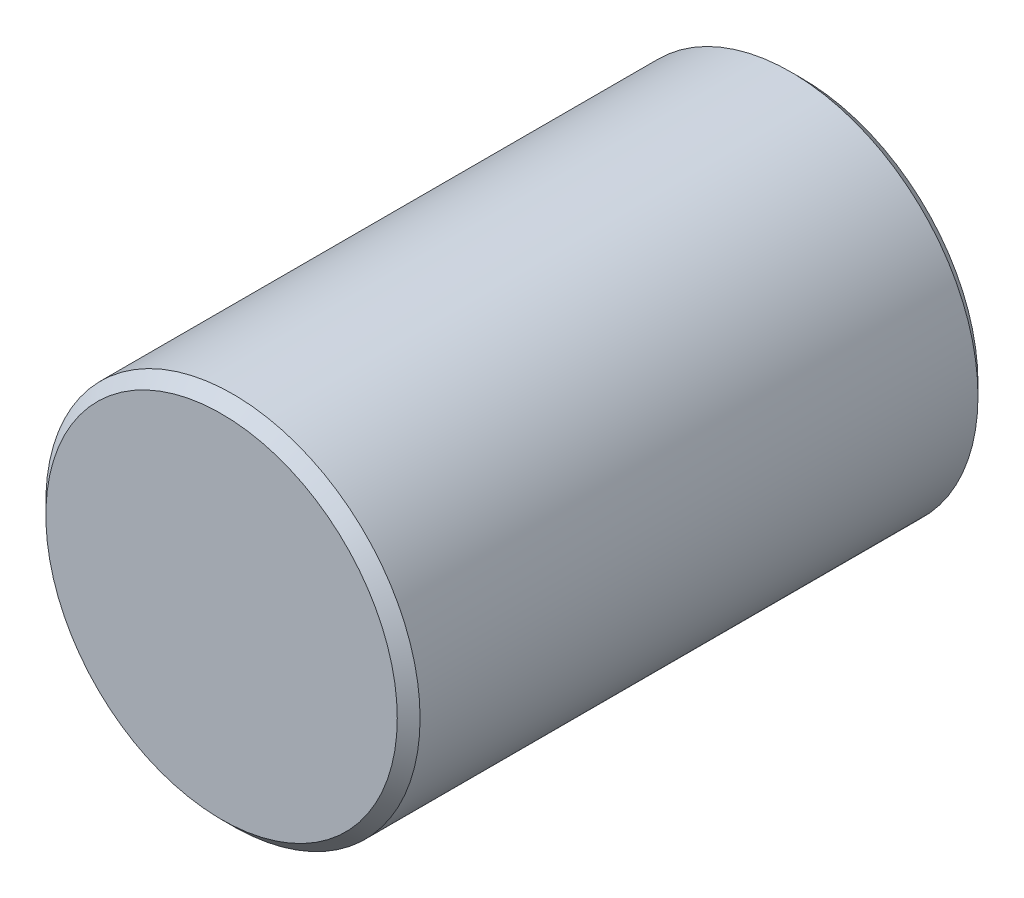
ISO-10303-21;
HEADER;
FILE_DESCRIPTION(('STEP AP214'),'2;1');
FILE_NAME('part.step','',(''),(''),'','','');
FILE_SCHEMA(('AUTOMOTIVE_DESIGN { 1 0 10303 214 1 1 1 1 }'));
ENDSEC;
DATA;
#1=APPLICATION_CONTEXT('core data for automotive mechanical design processes');
#2=APPLICATION_PROTOCOL_DEFINITION('international standard','automotive_design',2000,#1);
#3=PRODUCT_CONTEXT('',#1,'mechanical');
#4=PRODUCT('Part','Part','',(#3));
#5=PRODUCT_RELATED_PRODUCT_CATEGORY('part','',(#4));
#6=PRODUCT_DEFINITION_FORMATION('','',#4);
#7=PRODUCT_DEFINITION_CONTEXT('part definition',#1,'design');
#8=PRODUCT_DEFINITION('design','',#6,#7);
#9=PRODUCT_DEFINITION_SHAPE('','',#8);
#10=(LENGTH_UNIT() NAMED_UNIT(*) SI_UNIT(.MILLI.,.METRE.));
#11=(NAMED_UNIT(*) PLANE_ANGLE_UNIT() SI_UNIT($,.RADIAN.));
#12=(NAMED_UNIT(*) SI_UNIT($,.STERADIAN.) SOLID_ANGLE_UNIT());
#13=UNCERTAINTY_MEASURE_WITH_UNIT(LENGTH_MEASURE(1.E-05),#10,'distance_accuracy_value','');
#14=(GEOMETRIC_REPRESENTATION_CONTEXT(3) GLOBAL_UNCERTAINTY_ASSIGNED_CONTEXT((#13)) GLOBAL_UNIT_ASSIGNED_CONTEXT((#10,
#11,#12)) REPRESENTATION_CONTEXT('',''));
#15=CARTESIAN_POINT('',(0.,0.,0.));
#16=DIRECTION('',(0.,0.,1.));
#17=DIRECTION('',(1.,0.,0.));
#18=AXIS2_PLACEMENT_3D('',#15,#16,#17);
#19=CARTESIAN_POINT('',(0.,0.,9.));
#20=DIRECTION('',(0.,0.,1.));
#21=DIRECTION('',(1.,0.,0.));
#22=AXIS2_PLACEMENT_3D('',#19,#20,#21);
#23=PLANE('',#22);
#24=CARTESIAN_POINT('',(0.,0.,9.));
#25=DIRECTION('',(0.,0.,1.));
#26=DIRECTION('',(1.,0.,0.));
#27=AXIS2_PLACEMENT_3D('',#24,#25,#26);
#28=CIRCLE('',#27,5.44645136221662);
#29=CARTESIAN_POINT('',(5.44645136221662,0.,9.));
#30=VERTEX_POINT('',#29);
#31=EDGE_CURVE('E53',#30,#30,#28,.T.);
#32=ORIENTED_EDGE('',*,*,#31,.T.);
#33=EDGE_LOOP('',(#32));
#34=FACE_BOUND('',#33,.T.);
#35=ADVANCED_FACE('F37',(#34),#23,.T.);
#36=CARTESIAN_POINT('',(0.,0.,9.));
#37=DIRECTION('',(0.,0.,-1.));
#38=DIRECTION('',(-1.,0.,0.));
#39=AXIS2_PLACEMENT_3D('',#36,#37,#38);
#40=CONICAL_SURFACE('',#39,5.44645136221662,0.785398163397451);
#41=CARTESIAN_POINT('',(0.,0.,8.64645136221662));
#42=DIRECTION('',(0.,0.,1.));
#43=DIRECTION('',(1.,0.,0.));
#44=AXIS2_PLACEMENT_3D('',#41,#42,#43);
#45=CIRCLE('',#44,5.8);
#46=CARTESIAN_POINT('',(5.8,0.,8.64645136221662));
#47=VERTEX_POINT('',#46);
#48=EDGE_CURVE('E41',#47,#47,#45,.T.);
#49=ORIENTED_EDGE('',*,*,#48,.T.);
#50=EDGE_LOOP('',(#49));
#51=FACE_BOUND('',#50,.T.);
#52=ORIENTED_EDGE('',*,*,#31,.F.);
#53=EDGE_LOOP('',(#52));
#54=FACE_BOUND('',#53,.T.);
#55=ADVANCED_FACE('F62',(#51,#54),#40,.T.);
#56=CARTESIAN_POINT('',(0.,0.,9.));
#57=DIRECTION('',(0.,0.,-1.));
#58=DIRECTION('',(-1.,0.,0.));
#59=AXIS2_PLACEMENT_3D('',#56,#57,#58);
#60=CYLINDRICAL_SURFACE('',#59,5.8);
#61=ORIENTED_EDGE('',*,*,#48,.F.);
#62=EDGE_LOOP('',(#61));
#63=FACE_BOUND('',#62,.T.);
#64=CARTESIAN_POINT('',(0.,0.,-8.64645136221661));
#65=DIRECTION('',(0.,0.,1.));
#66=DIRECTION('',(1.,0.,0.));
#67=AXIS2_PLACEMENT_3D('',#64,#65,#66);
#68=CIRCLE('',#67,5.8);
#69=CARTESIAN_POINT('',(5.8,0.,-8.64645136221661));
#70=VERTEX_POINT('',#69);
#71=EDGE_CURVE('E46',#70,#70,#68,.T.);
#72=ORIENTED_EDGE('',*,*,#71,.T.);
#73=EDGE_LOOP('',(#72));
#74=FACE_BOUND('',#73,.T.);
#75=ADVANCED_FACE('F39',(#63,#74),#60,.T.);
#76=CARTESIAN_POINT('',(0.,0.,-8.64645136221661));
#77=DIRECTION('',(0.,0.,1.));
#78=DIRECTION('',(1.,0.,0.));
#79=AXIS2_PLACEMENT_3D('',#76,#77,#78);
#80=CONICAL_SURFACE('',#79,5.8,0.785398163397434);
#81=CARTESIAN_POINT('',(0.,0.,-9.));
#82=DIRECTION('',(0.,0.,1.));
#83=DIRECTION('',(1.,0.,0.));
#84=AXIS2_PLACEMENT_3D('',#81,#82,#83);
#85=CIRCLE('',#84,5.44645136221662);
#86=CARTESIAN_POINT('',(5.44645136221662,0.,-9.));
#87=VERTEX_POINT('',#86);
#88=EDGE_CURVE('E10',#87,#87,#85,.T.);
#89=ORIENTED_EDGE('',*,*,#88,.T.);
#90=EDGE_LOOP('',(#89));
#91=FACE_BOUND('',#90,.T.);
#92=ORIENTED_EDGE('',*,*,#71,.F.);
#93=EDGE_LOOP('',(#92));
#94=FACE_BOUND('',#93,.T.);
#95=ADVANCED_FACE('F67',(#91,#94),#80,.T.);
#96=CARTESIAN_POINT('',(0.,0.,-9.));
#97=DIRECTION('',(0.,0.,1.));
#98=DIRECTION('',(1.,0.,0.));
#99=AXIS2_PLACEMENT_3D('',#96,#97,#98);
#100=PLANE('',#99);
#101=ORIENTED_EDGE('',*,*,#88,.F.);
#102=EDGE_LOOP('',(#101));
#103=FACE_BOUND('',#102,.T.);
#104=ADVANCED_FACE('F71',(#103),#100,.F.);
#105=CLOSED_SHELL('',(#35,#55,#75,#95,#104));
#106=MANIFOLD_SOLID_BREP('B2',#105);
#107=ADVANCED_BREP_SHAPE_REPRESENTATION('',(#18,#106),#14);
#108=SHAPE_DEFINITION_REPRESENTATION(#9,#107);
ENDSEC;
END-ISO-10303-21;
